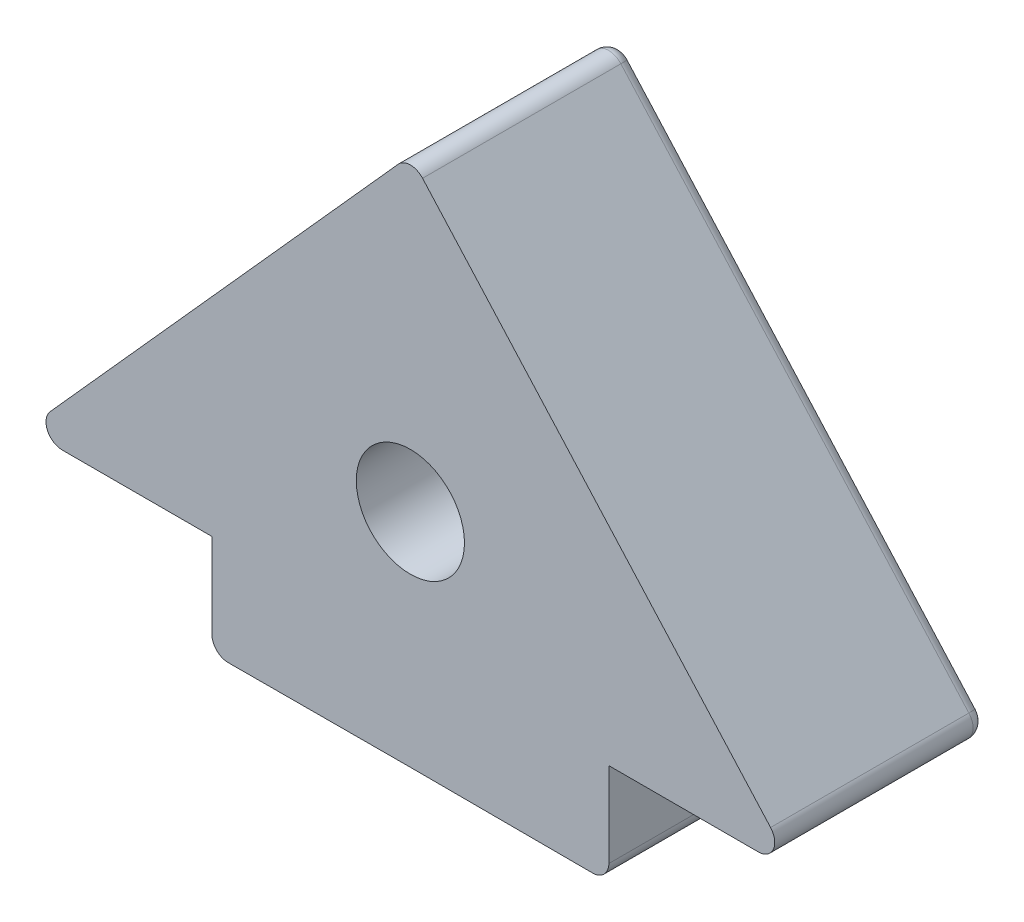
ISO-10303-21;
HEADER;
FILE_DESCRIPTION(('STEP AP214'),'2;1');
FILE_NAME('part.step','',(''),(''),'','','');
FILE_SCHEMA(('AUTOMOTIVE_DESIGN { 1 0 10303 214 1 1 1 1 }'));
ENDSEC;
DATA;
#1=APPLICATION_CONTEXT('core data for automotive mechanical design processes');
#2=APPLICATION_PROTOCOL_DEFINITION('international standard','automotive_design',2000,#1);
#3=PRODUCT_CONTEXT('',#1,'mechanical');
#4=PRODUCT('Part','Part','',(#3));
#5=PRODUCT_RELATED_PRODUCT_CATEGORY('part','',(#4));
#6=PRODUCT_DEFINITION_FORMATION('','',#4);
#7=PRODUCT_DEFINITION_CONTEXT('part definition',#1,'design');
#8=PRODUCT_DEFINITION('design','',#6,#7);
#9=PRODUCT_DEFINITION_SHAPE('','',#8);
#10=(LENGTH_UNIT() NAMED_UNIT(*) SI_UNIT(.MILLI.,.METRE.));
#11=(NAMED_UNIT(*) PLANE_ANGLE_UNIT() SI_UNIT($,.RADIAN.));
#12=(NAMED_UNIT(*) SI_UNIT($,.STERADIAN.) SOLID_ANGLE_UNIT());
#13=UNCERTAINTY_MEASURE_WITH_UNIT(LENGTH_MEASURE(1.E-05),#10,'distance_accuracy_value','');
#14=(GEOMETRIC_REPRESENTATION_CONTEXT(3) GLOBAL_UNCERTAINTY_ASSIGNED_CONTEXT((#13)) GLOBAL_UNIT_ASSIGNED_CONTEXT((#10,
#11,#12)) REPRESENTATION_CONTEXT('',''));
#15=CARTESIAN_POINT('',(0.,0.,0.));
#16=DIRECTION('',(0.,0.,1.));
#17=DIRECTION('',(1.,0.,0.));
#18=AXIS2_PLACEMENT_3D('',#15,#16,#17);
#19=CARTESIAN_POINT('',(0.,-1.30828258674903,7.));
#20=DIRECTION('',(0.,0.,-1.));
#21=DIRECTION('',(-1.,0.,0.));
#22=AXIS2_PLACEMENT_3D('',#19,#20,#21);
#23=CYLINDRICAL_SURFACE('',#22,1.8);
#24=CARTESIAN_POINT('',(0.,-1.30828258674903,7.));
#25=DIRECTION('',(0.,0.,1.));
#26=DIRECTION('',(1.,0.,0.));
#27=AXIS2_PLACEMENT_3D('',#24,#25,#26);
#28=CIRCLE('',#27,1.8);
#29=CARTESIAN_POINT('',(1.80000000000001,-1.30828258674903,7.));
#30=VERTEX_POINT('',#29);
#31=EDGE_CURVE('E195',#30,#30,#28,.T.);
#32=ORIENTED_EDGE('',*,*,#31,.T.);
#33=EDGE_LOOP('',(#32));
#34=FACE_BOUND('',#33,.T.);
#35=CARTESIAN_POINT('',(0.,-1.30828258674903,2.));
#36=DIRECTION('',(0.,0.,-1.));
#37=DIRECTION('',(-1.,0.,0.));
#38=AXIS2_PLACEMENT_3D('',#35,#36,#37);
#39=CIRCLE('',#38,1.8);
#40=CARTESIAN_POINT('',(-1.79999999999999,-1.30828258674903,2.));
#41=VERTEX_POINT('',#40);
#42=EDGE_CURVE('E289',#41,#41,#39,.T.);
#43=ORIENTED_EDGE('',*,*,#42,.T.);
#44=EDGE_LOOP('',(#43));
#45=FACE_BOUND('',#44,.T.);
#46=ADVANCED_FACE('F35',(#34,#45),#23,.F.);
#47=CARTESIAN_POINT('',(0.,8.14273922744921,7.));
#48=DIRECTION('',(0.,0.,1.));
#49=DIRECTION('',(1.,0.,0.));
#50=AXIS2_PLACEMENT_3D('',#47,#48,#49);
#51=PLANE('',#50);
#52=CARTESIAN_POINT('',(0.,8.14273922744921,7.));
#53=DIRECTION('',(0.,0.,1.));
#54=DIRECTION('',(1.,0.,0.));
#55=AXIS2_PLACEMENT_3D('',#52,#53,#54);
#56=CIRCLE('',#55,0.544410820616518);
#57=CARTESIAN_POINT('',(0.405379360705237,8.5061270581736,7.));
#58=VERTEX_POINT('',#57);
#59=CARTESIAN_POINT('',(-0.405379360705209,8.50612705817359,7.));
#60=VERTEX_POINT('',#59);
#61=EDGE_CURVE('E185',#58,#60,#56,.T.);
#62=ORIENTED_EDGE('',*,*,#61,.T.);
#63=DIRECTION('',(-0.667488258798507,-0.744620322289244,0.));
#64=VECTOR('',#63,1.);
#65=CARTESIAN_POINT('',(-0.405379360705209,8.50612705817359,7.));
#66=LINE('',#65,#64);
#67=CARTESIAN_POINT('',(-11.9870607409533,-4.41388345637082,7.));
#68=VERTEX_POINT('',#67);
#69=EDGE_CURVE('E174',#60,#68,#66,.T.);
#70=ORIENTED_EDGE('',*,*,#69,.T.);
#71=CARTESIAN_POINT('',(-11.581681380248,-4.77727128709523,7.));
#72=DIRECTION('',(0.,0.,1.));
#73=DIRECTION('',(1.,0.,0.));
#74=AXIS2_PLACEMENT_3D('',#71,#72,#73);
#75=CIRCLE('',#74,0.544410820616544);
#76=CARTESIAN_POINT('',(-11.581681380248,-5.32168210771177,7.));
#77=VERTEX_POINT('',#76);
#78=EDGE_CURVE('E184',#68,#77,#75,.T.);
#79=ORIENTED_EDGE('',*,*,#78,.T.);
#80=DIRECTION('',(1.,0.,0.));
#81=VECTOR('',#80,1.);
#82=CARTESIAN_POINT('',(-11.581681380248,-5.32168210771176,7.));
#83=LINE('',#82,#81);
#84=CARTESIAN_POINT('',(-6.60521513926172,-5.32168210771173,7.));
#85=VERTEX_POINT('',#84);
#86=EDGE_CURVE('E302',#77,#85,#83,.T.);
#87=ORIENTED_EDGE('',*,*,#86,.T.);
#88=DIRECTION('',(0.,-1.,0.));
#89=VECTOR('',#88,1.);
#90=CARTESIAN_POINT('',(-6.60521513926172,-5.32168210771173,7.));
#91=LINE('',#90,#89);
#92=CARTESIAN_POINT('',(-6.60521513926172,-8.14273922744922,7.));
#93=VERTEX_POINT('',#92);
#94=EDGE_CURVE('E304',#85,#93,#91,.T.);
#95=ORIENTED_EDGE('',*,*,#94,.T.);
#96=CARTESIAN_POINT('',(-6.0608043186452,-8.14273922744922,7.));
#97=DIRECTION('',(0.,0.,1.));
#98=DIRECTION('',(1.,0.,0.));
#99=AXIS2_PLACEMENT_3D('',#96,#97,#98);
#100=CIRCLE('',#99,0.544410820616517);
#101=CARTESIAN_POINT('',(-6.05945404471599,-8.68714837355595,7.));
#102=VERTEX_POINT('',#101);
#103=EDGE_CURVE('E306',#93,#102,#100,.T.);
#104=ORIENTED_EDGE('',*,*,#103,.T.);
#105=DIRECTION('',(0.999996924179834,0.00248024814729872,0.));
#106=VECTOR('',#105,1.);
#107=CARTESIAN_POINT('',(-6.05945404471599,-8.68714837355595,7.));
#108=LINE('',#107,#106);
#109=CARTESIAN_POINT('',(2.79941000935757E-11,-8.67211937766134,7.));
#110=VERTEX_POINT('',#109);
#111=EDGE_CURVE('E308',#102,#110,#108,.T.);
#112=ORIENTED_EDGE('',*,*,#111,.T.);
#113=DIRECTION('',(0.999996924179833,-0.00248024814732191,0.));
#114=VECTOR('',#113,1.);
#115=CARTESIAN_POINT('',(6.05945404471602,-8.68714837355595,7.));
#116=LINE('',#115,#114);
#117=CARTESIAN_POINT('',(6.05945404471602,-8.68714837355595,7.));
#118=VERTEX_POINT('',#117);
#119=EDGE_CURVE('E310',#110,#118,#116,.T.);
#120=ORIENTED_EDGE('',*,*,#119,.T.);
#121=CARTESIAN_POINT('',(6.06080431864523,-8.14273922744922,7.));
#122=DIRECTION('',(0.,0.,1.));
#123=DIRECTION('',(1.,0.,0.));
#124=AXIS2_PLACEMENT_3D('',#121,#122,#123);
#125=CIRCLE('',#124,0.544410820616515);
#126=CARTESIAN_POINT('',(6.60521513926175,-8.14273922744922,7.));
#127=VERTEX_POINT('',#126);
#128=EDGE_CURVE('E312',#118,#127,#125,.T.);
#129=ORIENTED_EDGE('',*,*,#128,.T.);
#130=DIRECTION('',(0.,1.,0.));
#131=VECTOR('',#130,1.);
#132=CARTESIAN_POINT('',(6.60521513926175,-5.32168210771175,7.));
#133=LINE('',#132,#131);
#134=CARTESIAN_POINT('',(6.60521513926175,-5.32168210771175,7.));
#135=VERTEX_POINT('',#134);
#136=EDGE_CURVE('E314',#127,#135,#133,.T.);
#137=ORIENTED_EDGE('',*,*,#136,.T.);
#138=DIRECTION('',(1.,0.,0.));
#139=VECTOR('',#138,1.);
#140=CARTESIAN_POINT('',(11.5816813802481,-5.32168210771175,7.));
#141=LINE('',#140,#139);
#142=CARTESIAN_POINT('',(11.5816813802481,-5.32168210771175,7.));
#143=VERTEX_POINT('',#142);
#144=EDGE_CURVE('E316',#135,#143,#141,.T.);
#145=ORIENTED_EDGE('',*,*,#144,.T.);
#146=CARTESIAN_POINT('',(11.5816813802481,-4.77727128709523,7.));
#147=DIRECTION('',(0.,0.,1.));
#148=DIRECTION('',(1.,0.,0.));
#149=AXIS2_PLACEMENT_3D('',#146,#147,#148);
#150=CIRCLE('',#149,0.544410820616517);
#151=CARTESIAN_POINT('',(11.9870607409533,-4.41388345637085,7.));
#152=VERTEX_POINT('',#151);
#153=EDGE_CURVE('E318',#143,#152,#150,.T.);
#154=ORIENTED_EDGE('',*,*,#153,.T.);
#155=DIRECTION('',(-0.667488258798505,0.744620322289245,0.));
#156=VECTOR('',#155,1.);
#157=CARTESIAN_POINT('',(0.405379360705237,8.5061270581736,7.));
#158=LINE('',#157,#156);
#159=EDGE_CURVE('E191',#152,#58,#158,.T.);
#160=ORIENTED_EDGE('',*,*,#159,.T.);
#161=EDGE_LOOP('',(#62,#70,#79,#87,#95,#104,#112,#120,#129,#137,#145,#154,#160));
#162=FACE_BOUND('',#161,.T.);
#163=ORIENTED_EDGE('',*,*,#31,.F.);
#164=EDGE_LOOP('',(#163));
#165=FACE_BOUND('',#164,.T.);
#166=ADVANCED_FACE('F188',(#162,#165),#51,.T.);
#167=CARTESIAN_POINT('',(0.,8.14273922744921,0.));
#168=DIRECTION('',(0.,0.,1.));
#169=DIRECTION('',(1.,0.,0.));
#170=AXIS2_PLACEMENT_3D('',#167,#168,#169);
#171=PLANE('',#170);
#172=DIRECTION('',(0.999996924179834,-0.00248024814732191,0.));
#173=VECTOR('',#172,1.);
#174=CARTESIAN_POINT('',(-0.0407127943667151,-8.27201716918603,0.));
#175=LINE('',#174,#173);
#176=CARTESIAN_POINT('',(6.06044614397494,-8.28714960388402,0.));
#177=VERTEX_POINT('',#176);
#178=CARTESIAN_POINT('',(-0.000992087024868527,-8.27211568669985,0.));
#179=VERTEX_POINT('',#178);
#180=EDGE_CURVE('E231',#177,#179,#175,.F.);
#181=ORIENTED_EDGE('',*,*,#180,.T.);
#182=DIRECTION('',(0.999996924179834,0.00248024814729872,0.));
#183=VECTOR('',#182,1.);
#184=CARTESIAN_POINT('',(0.0407127943663625,-8.27201716918617,0.));
#185=LINE('',#184,#183);
#186=CARTESIAN_POINT('',(-6.06044614397492,-8.28714960388402,0.));
#187=VERTEX_POINT('',#186);
#188=EDGE_CURVE('E233',#179,#187,#185,.F.);
#189=ORIENTED_EDGE('',*,*,#188,.T.);
#190=CARTESIAN_POINT('',(-6.0608043186452,-8.14273922744922,0.));
#191=DIRECTION('',(0.,0.,1.));
#192=DIRECTION('',(1.,0.,0.));
#193=AXIS2_PLACEMENT_3D('',#190,#191,#192);
#194=CIRCLE('',#193,0.144410820616516);
#195=CARTESIAN_POINT('',(-6.20521513926172,-8.14273922744922,0.));
#196=VERTEX_POINT('',#195);
#197=EDGE_CURVE('E228',#187,#196,#194,.F.);
#198=ORIENTED_EDGE('',*,*,#197,.T.);
#199=DIRECTION('',(0.,-1.,0.));
#200=VECTOR('',#199,1.);
#201=CARTESIAN_POINT('',(-6.20521513926172,8.14273922744921,0.));
#202=LINE('',#201,#200);
#203=CARTESIAN_POINT('',(-6.20521513926172,-4.92168210771173,0.));
#204=VERTEX_POINT('',#203);
#205=EDGE_CURVE('E224',#196,#204,#202,.F.);
#206=ORIENTED_EDGE('',*,*,#205,.T.);
#207=DIRECTION('',(1.,0.,0.));
#208=VECTOR('',#207,1.);
#209=CARTESIAN_POINT('',(0.,-4.9216821077117,0.));
#210=LINE('',#209,#208);
#211=CARTESIAN_POINT('',(-11.581681380248,-4.92168210771177,0.));
#212=VERTEX_POINT('',#211);
#213=EDGE_CURVE('E222',#204,#212,#210,.F.);
#214=ORIENTED_EDGE('',*,*,#213,.T.);
#215=CARTESIAN_POINT('',(-11.581681380248,-4.77727128709523,0.));
#216=DIRECTION('',(0.,0.,1.));
#217=DIRECTION('',(1.,0.,0.));
#218=AXIS2_PLACEMENT_3D('',#215,#216,#217);
#219=CIRCLE('',#218,0.144410820616544);
#220=CARTESIAN_POINT('',(-11.6892126120376,-4.68087875989022,0.));
#221=VERTEX_POINT('',#220);
#222=EDGE_CURVE('E218',#212,#221,#219,.F.);
#223=ORIENTED_EDGE('',*,*,#222,.T.);
#224=DIRECTION('',(-0.667488258798507,-0.744620322289244,0.));
#225=VECTOR('',#224,1.);
#226=CARTESIAN_POINT('',(-0.107531231789511,8.23913175465419,0.));
#227=LINE('',#226,#225);
#228=CARTESIAN_POINT('',(-0.107531231789512,8.23913175465419,0.));
#229=VERTEX_POINT('',#228);
#230=EDGE_CURVE('E214',#221,#229,#227,.F.);
#231=ORIENTED_EDGE('',*,*,#230,.T.);
#232=CARTESIAN_POINT('',(0.,8.14273922744921,0.));
#233=DIRECTION('',(0.,0.,1.));
#234=DIRECTION('',(1.,0.,0.));
#235=AXIS2_PLACEMENT_3D('',#232,#233,#234);
#236=CIRCLE('',#235,0.144410820616518);
#237=CARTESIAN_POINT('',(0.107531231789539,8.23913175465419,0.));
#238=VERTEX_POINT('',#237);
#239=EDGE_CURVE('E210',#229,#238,#236,.F.);
#240=ORIENTED_EDGE('',*,*,#239,.T.);
#241=DIRECTION('',(-0.667488258798505,0.744620322289245,0.));
#242=VECTOR('',#241,1.);
#243=CARTESIAN_POINT('',(0.107531231789539,8.23913175465419,0.));
#244=LINE('',#243,#242);
#245=CARTESIAN_POINT('',(11.6892126120376,-4.68087875989025,0.));
#246=VERTEX_POINT('',#245);
#247=EDGE_CURVE('E203',#238,#246,#244,.F.);
#248=ORIENTED_EDGE('',*,*,#247,.T.);
#249=CARTESIAN_POINT('',(11.5816813802481,-4.77727128709523,0.));
#250=DIRECTION('',(0.,0.,1.));
#251=DIRECTION('',(1.,0.,0.));
#252=AXIS2_PLACEMENT_3D('',#249,#250,#251);
#253=CIRCLE('',#252,0.144410820616517);
#254=CARTESIAN_POINT('',(11.5816813802481,-4.92168210771175,0.));
#255=VERTEX_POINT('',#254);
#256=EDGE_CURVE('E212',#246,#255,#253,.F.);
#257=ORIENTED_EDGE('',*,*,#256,.T.);
#258=DIRECTION('',(1.,0.,0.));
#259=VECTOR('',#258,1.);
#260=CARTESIAN_POINT('',(0.,-4.92168210771175,0.));
#261=LINE('',#260,#259);
#262=CARTESIAN_POINT('',(6.20521513926175,-4.92168210771175,0.));
#263=VERTEX_POINT('',#262);
#264=EDGE_CURVE('E216',#255,#263,#261,.F.);
#265=ORIENTED_EDGE('',*,*,#264,.T.);
#266=DIRECTION('',(0.,1.,0.));
#267=VECTOR('',#266,1.);
#268=CARTESIAN_POINT('',(6.20521513926177,8.1427392274492,0.));
#269=LINE('',#268,#267);
#270=CARTESIAN_POINT('',(6.20521513926175,-8.14273922744922,0.));
#271=VERTEX_POINT('',#270);
#272=EDGE_CURVE('E220',#263,#271,#269,.F.);
#273=ORIENTED_EDGE('',*,*,#272,.T.);
#274=CARTESIAN_POINT('',(6.06080431864523,-8.14273922744922,0.));
#275=DIRECTION('',(0.,0.,1.));
#276=DIRECTION('',(1.,0.,0.));
#277=AXIS2_PLACEMENT_3D('',#274,#275,#276);
#278=CIRCLE('',#277,0.144410820616515);
#279=EDGE_CURVE('E226',#271,#177,#278,.F.);
#280=ORIENTED_EDGE('',*,*,#279,.T.);
#281=EDGE_LOOP('',(#181,#189,#198,#206,#214,#223,#231,#240,#248,#257,#265,#273,#280));
#282=FACE_BOUND('',#281,.T.);
#283=ADVANCED_FACE('F384',(#282),#171,.F.);
#284=CARTESIAN_POINT('',(0.,8.14273922744921,7.));
#285=DIRECTION('',(0.,0.,-1.));
#286=DIRECTION('',(-1.,0.,0.));
#287=AXIS2_PLACEMENT_3D('',#284,#285,#286);
#288=CYLINDRICAL_SURFACE('',#287,0.544410820616518);
#289=DIRECTION('',(0.,0.,-1.));
#290=VECTOR('',#289,1.);
#291=CARTESIAN_POINT('',(0.405379360705237,8.5061270581736,7.));
#292=LINE('',#291,#290);
#293=CARTESIAN_POINT('',(0.405379360705237,8.5061270581736,0.4));
#294=VERTEX_POINT('',#293);
#295=EDGE_CURVE('E321',#58,#294,#292,.T.);
#296=ORIENTED_EDGE('',*,*,#295,.T.);
#297=CARTESIAN_POINT('',(0.,8.14273922744921,0.4));
#298=DIRECTION('',(0.,0.,1.));
#299=DIRECTION('',(1.,0.,0.));
#300=AXIS2_PLACEMENT_3D('',#297,#298,#299);
#301=CIRCLE('',#300,0.544410820616518);
#302=CARTESIAN_POINT('',(-0.405379360705209,8.50612705817359,0.4));
#303=VERTEX_POINT('',#302);
#304=EDGE_CURVE('E199',#294,#303,#301,.T.);
#305=ORIENTED_EDGE('',*,*,#304,.T.);
#306=DIRECTION('',(0.,0.,-1.));
#307=VECTOR('',#306,1.);
#308=CARTESIAN_POINT('',(-0.405379360705209,8.50612705817359,7.));
#309=LINE('',#308,#307);
#310=EDGE_CURVE('E178',#60,#303,#309,.T.);
#311=ORIENTED_EDGE('',*,*,#310,.F.);
#312=ORIENTED_EDGE('',*,*,#61,.F.);
#313=EDGE_LOOP('',(#296,#305,#311,#312));
#314=FACE_BOUND('',#313,.T.);
#315=ADVANCED_FACE('F197',(#314),#288,.T.);
#316=CARTESIAN_POINT('',(-0.405379360705209,8.50612705817359,7.));
#317=DIRECTION('',(0.744620322289244,-0.667488258798507,0.));
#318=DIRECTION('',(0.667488258798507,0.744620322289244,0.));
#319=AXIS2_PLACEMENT_3D('',#316,#317,#318);
#320=PLANE('',#319);
#321=ORIENTED_EDGE('',*,*,#310,.T.);
#322=DIRECTION('',(-0.667488258798507,-0.744620322289244,0.));
#323=VECTOR('',#322,1.);
#324=CARTESIAN_POINT('',(-0.405379360705209,8.50612705817359,0.4));
#325=LINE('',#324,#323);
#326=CARTESIAN_POINT('',(-11.9870607409533,-4.41388345637082,0.4));
#327=VERTEX_POINT('',#326);
#328=EDGE_CURVE('E44',#303,#327,#325,.T.);
#329=ORIENTED_EDGE('',*,*,#328,.T.);
#330=DIRECTION('',(0.,0.,-1.));
#331=VECTOR('',#330,1.);
#332=CARTESIAN_POINT('',(-11.9870607409533,-4.41388345637082,7.));
#333=LINE('',#332,#331);
#334=EDGE_CURVE('E181',#68,#327,#333,.T.);
#335=ORIENTED_EDGE('',*,*,#334,.F.);
#336=ORIENTED_EDGE('',*,*,#69,.F.);
#337=EDGE_LOOP('',(#321,#329,#335,#336));
#338=FACE_BOUND('',#337,.T.);
#339=ADVANCED_FACE('F176',(#338),#320,.F.);
#340=CARTESIAN_POINT('',(-11.581681380248,-4.77727128709523,7.));
#341=DIRECTION('',(0.,0.,-1.));
#342=DIRECTION('',(-1.,0.,0.));
#343=AXIS2_PLACEMENT_3D('',#340,#341,#342);
#344=CYLINDRICAL_SURFACE('',#343,0.544410820616544);
#345=ORIENTED_EDGE('',*,*,#334,.T.);
#346=CARTESIAN_POINT('',(-11.581681380248,-4.77727128709523,0.4));
#347=DIRECTION('',(0.,0.,1.));
#348=DIRECTION('',(1.,0.,0.));
#349=AXIS2_PLACEMENT_3D('',#346,#347,#348);
#350=CIRCLE('',#349,0.544410820616544);
#351=CARTESIAN_POINT('',(-11.581681380248,-5.32168210771177,0.4));
#352=VERTEX_POINT('',#351);
#353=EDGE_CURVE('E239',#327,#352,#350,.T.);
#354=ORIENTED_EDGE('',*,*,#353,.T.);
#355=DIRECTION('',(0.,0.,-1.));
#356=VECTOR('',#355,1.);
#357=CARTESIAN_POINT('',(-11.581681380248,-5.32168210771177,7.));
#358=LINE('',#357,#356);
#359=EDGE_CURVE('E205',#77,#352,#358,.T.);
#360=ORIENTED_EDGE('',*,*,#359,.F.);
#361=ORIENTED_EDGE('',*,*,#78,.F.);
#362=EDGE_LOOP('',(#345,#354,#360,#361));
#363=FACE_BOUND('',#362,.T.);
#364=ADVANCED_FACE('F377',(#363),#344,.T.);
#365=CARTESIAN_POINT('',(-11.581681380248,-5.32168210771176,7.));
#366=DIRECTION('',(0.,1.,0.));
#367=DIRECTION('',(-1.,0.,0.));
#368=AXIS2_PLACEMENT_3D('',#365,#366,#367);
#369=PLANE('',#368);
#370=ORIENTED_EDGE('',*,*,#359,.T.);
#371=DIRECTION('',(1.,0.,0.));
#372=VECTOR('',#371,1.);
#373=CARTESIAN_POINT('',(-11.581681380248,-5.32168210771176,0.4));
#374=LINE('',#373,#372);
#375=CARTESIAN_POINT('',(-6.60521513926172,-5.32168210771173,0.4));
#376=VERTEX_POINT('',#375);
#377=EDGE_CURVE('E246',#352,#376,#374,.T.);
#378=ORIENTED_EDGE('',*,*,#377,.T.);
#379=DIRECTION('',(0.,0.,-1.));
#380=VECTOR('',#379,1.);
#381=CARTESIAN_POINT('',(-6.60521513926172,-5.32168210771173,7.));
#382=LINE('',#381,#380);
#383=EDGE_CURVE('E343',#85,#376,#382,.T.);
#384=ORIENTED_EDGE('',*,*,#383,.F.);
#385=ORIENTED_EDGE('',*,*,#86,.F.);
#386=EDGE_LOOP('',(#370,#378,#384,#385));
#387=FACE_BOUND('',#386,.T.);
#388=ADVANCED_FACE('F350',(#387),#369,.F.);
#389=CARTESIAN_POINT('',(-6.60521513926172,-5.32168210771173,7.));
#390=DIRECTION('',(1.,0.,0.));
#391=DIRECTION('',(0.,0.,-1.));
#392=AXIS2_PLACEMENT_3D('',#389,#390,#391);
#393=PLANE('',#392);
#394=ORIENTED_EDGE('',*,*,#383,.T.);
#395=DIRECTION('',(0.,-1.,0.));
#396=VECTOR('',#395,1.);
#397=CARTESIAN_POINT('',(-6.60521513926172,-5.32168210771173,0.4));
#398=LINE('',#397,#396);
#399=CARTESIAN_POINT('',(-6.60521513926172,-8.14273922744922,0.4));
#400=VERTEX_POINT('',#399);
#401=EDGE_CURVE('E242',#376,#400,#398,.T.);
#402=ORIENTED_EDGE('',*,*,#401,.T.);
#403=DIRECTION('',(0.,0.,-1.));
#404=VECTOR('',#403,1.);
#405=CARTESIAN_POINT('',(-6.60521513926172,-8.14273922744922,7.));
#406=LINE('',#405,#404);
#407=EDGE_CURVE('E340',#93,#400,#406,.T.);
#408=ORIENTED_EDGE('',*,*,#407,.F.);
#409=ORIENTED_EDGE('',*,*,#94,.F.);
#410=EDGE_LOOP('',(#394,#402,#408,#409));
#411=FACE_BOUND('',#410,.T.);
#412=ADVANCED_FACE('F370',(#411),#393,.F.);
#413=CARTESIAN_POINT('',(-6.0608043186452,-8.14273922744922,7.));
#414=DIRECTION('',(0.,0.,-1.));
#415=DIRECTION('',(-1.,0.,0.));
#416=AXIS2_PLACEMENT_3D('',#413,#414,#415);
#417=CYLINDRICAL_SURFACE('',#416,0.544410820616517);
#418=ORIENTED_EDGE('',*,*,#407,.T.);
#419=CARTESIAN_POINT('',(-6.0608043186452,-8.14273922744922,0.4));
#420=DIRECTION('',(0.,0.,1.));
#421=DIRECTION('',(1.,0.,0.));
#422=AXIS2_PLACEMENT_3D('',#419,#420,#421);
#423=CIRCLE('',#422,0.544410820616517);
#424=CARTESIAN_POINT('',(-6.05945404471599,-8.68714837355595,0.4));
#425=VERTEX_POINT('',#424);
#426=EDGE_CURVE('E200',#400,#425,#423,.T.);
#427=ORIENTED_EDGE('',*,*,#426,.T.);
#428=DIRECTION('',(0.,0.,-1.));
#429=VECTOR('',#428,1.);
#430=CARTESIAN_POINT('',(-6.05945404471599,-8.68714837355595,7.));
#431=LINE('',#430,#429);
#432=EDGE_CURVE('E338',#102,#425,#431,.T.);
#433=ORIENTED_EDGE('',*,*,#432,.F.);
#434=ORIENTED_EDGE('',*,*,#103,.F.);
#435=EDGE_LOOP('',(#418,#427,#433,#434));
#436=FACE_BOUND('',#435,.T.);
#437=ADVANCED_FACE('F374',(#436),#417,.T.);
#438=CARTESIAN_POINT('',(-6.05945404471599,-8.68714837355595,7.));
#439=DIRECTION('',(-0.00248024814729872,0.999996924179834,0.));
#440=DIRECTION('',(-0.999996924179834,-0.00248024814729872,0.));
#441=AXIS2_PLACEMENT_3D('',#438,#439,#440);
#442=PLANE('',#441);
#443=ORIENTED_EDGE('',*,*,#432,.T.);
#444=DIRECTION('',(0.999996924179834,0.00248024814729872,0.));
#445=VECTOR('',#444,1.);
#446=CARTESIAN_POINT('',(-6.05945404471599,-8.68714837355595,0.4));
#447=LINE('',#446,#445);
#448=CARTESIAN_POINT('',(2.79941000935757E-11,-8.67211937766134,0.4));
#449=VERTEX_POINT('',#448);
#450=EDGE_CURVE('E52',#425,#449,#447,.T.);
#451=ORIENTED_EDGE('',*,*,#450,.T.);
#452=DIRECTION('',(0.,0.,-1.));
#453=VECTOR('',#452,1.);
#454=CARTESIAN_POINT('',(2.79941000935757E-11,-8.67211937766134,7.));
#455=LINE('',#454,#453);
#456=EDGE_CURVE('E336',#110,#449,#455,.T.);
#457=ORIENTED_EDGE('',*,*,#456,.F.);
#458=ORIENTED_EDGE('',*,*,#111,.F.);
#459=EDGE_LOOP('',(#443,#451,#457,#458));
#460=FACE_BOUND('',#459,.T.);
#461=ADVANCED_FACE('F431',(#460),#442,.F.);
#462=CARTESIAN_POINT('',(6.05945404471602,-8.68714837355595,7.));
#463=DIRECTION('',(0.00248024814732191,0.999996924179834,0.));
#464=DIRECTION('',(-0.999996924179834,0.00248024814732191,0.));
#465=AXIS2_PLACEMENT_3D('',#462,#463,#464);
#466=PLANE('',#465);
#467=ORIENTED_EDGE('',*,*,#456,.T.);
#468=DIRECTION('',(0.999996924179834,-0.00248024814732191,0.));
#469=VECTOR('',#468,1.);
#470=CARTESIAN_POINT('',(6.05945404471602,-8.68714837355595,0.4));
#471=LINE('',#470,#469);
#472=CARTESIAN_POINT('',(6.05945404471602,-8.68714837355595,0.4));
#473=VERTEX_POINT('',#472);
#474=EDGE_CURVE('E249',#449,#473,#471,.T.);
#475=ORIENTED_EDGE('',*,*,#474,.T.);
#476=DIRECTION('',(0.,0.,-1.));
#477=VECTOR('',#476,1.);
#478=CARTESIAN_POINT('',(6.05945404471602,-8.68714837355595,7.));
#479=LINE('',#478,#477);
#480=EDGE_CURVE('E333',#118,#473,#479,.T.);
#481=ORIENTED_EDGE('',*,*,#480,.F.);
#482=ORIENTED_EDGE('',*,*,#119,.F.);
#483=EDGE_LOOP('',(#467,#475,#481,#482));
#484=FACE_BOUND('',#483,.T.);
#485=ADVANCED_FACE('F427',(#484),#466,.F.);
#486=CARTESIAN_POINT('',(6.06080431864523,-8.14273922744922,7.));
#487=DIRECTION('',(0.,0.,-1.));
#488=DIRECTION('',(-1.,0.,0.));
#489=AXIS2_PLACEMENT_3D('',#486,#487,#488);
#490=CYLINDRICAL_SURFACE('',#489,0.544410820616515);
#491=ORIENTED_EDGE('',*,*,#480,.T.);
#492=CARTESIAN_POINT('',(6.06080431864523,-8.14273922744922,0.4));
#493=DIRECTION('',(0.,0.,1.));
#494=DIRECTION('',(1.,0.,0.));
#495=AXIS2_PLACEMENT_3D('',#492,#493,#494);
#496=CIRCLE('',#495,0.544410820616515);
#497=CARTESIAN_POINT('',(6.60521513926175,-8.14273922744922,0.4));
#498=VERTEX_POINT('',#497);
#499=EDGE_CURVE('E235',#473,#498,#496,.T.);
#500=ORIENTED_EDGE('',*,*,#499,.T.);
#501=DIRECTION('',(0.,0.,-1.));
#502=VECTOR('',#501,1.);
#503=CARTESIAN_POINT('',(6.60521513926175,-8.14273922744922,7.));
#504=LINE('',#503,#502);
#505=EDGE_CURVE('E331',#127,#498,#504,.T.);
#506=ORIENTED_EDGE('',*,*,#505,.F.);
#507=ORIENTED_EDGE('',*,*,#128,.F.);
#508=EDGE_LOOP('',(#491,#500,#506,#507));
#509=FACE_BOUND('',#508,.T.);
#510=ADVANCED_FACE('F424',(#509),#490,.T.);
#511=CARTESIAN_POINT('',(6.60521513926175,-5.32168210771175,7.));
#512=DIRECTION('',(-1.,0.,0.));
#513=DIRECTION('',(0.,-1.,0.));
#514=AXIS2_PLACEMENT_3D('',#511,#512,#513);
#515=PLANE('',#514);
#516=ORIENTED_EDGE('',*,*,#505,.T.);
#517=DIRECTION('',(0.,1.,0.));
#518=VECTOR('',#517,1.);
#519=CARTESIAN_POINT('',(6.60521513926175,-5.32168210771175,0.4));
#520=LINE('',#519,#518);
#521=CARTESIAN_POINT('',(6.60521513926175,-5.32168210771175,0.4));
#522=VERTEX_POINT('',#521);
#523=EDGE_CURVE('E60',#498,#522,#520,.T.);
#524=ORIENTED_EDGE('',*,*,#523,.T.);
#525=DIRECTION('',(0.,0.,-1.));
#526=VECTOR('',#525,1.);
#527=CARTESIAN_POINT('',(6.60521513926175,-5.32168210771175,7.));
#528=LINE('',#527,#526);
#529=EDGE_CURVE('E329',#135,#522,#528,.T.);
#530=ORIENTED_EDGE('',*,*,#529,.F.);
#531=ORIENTED_EDGE('',*,*,#136,.F.);
#532=EDGE_LOOP('',(#516,#524,#530,#531));
#533=FACE_BOUND('',#532,.T.);
#534=ADVANCED_FACE('F420',(#533),#515,.F.);
#535=CARTESIAN_POINT('',(11.5816813802481,-5.32168210771175,7.));
#536=DIRECTION('',(0.,1.,0.));
#537=DIRECTION('',(0.,0.,1.));
#538=AXIS2_PLACEMENT_3D('',#535,#536,#537);
#539=PLANE('',#538);
#540=ORIENTED_EDGE('',*,*,#529,.T.);
#541=DIRECTION('',(1.,0.,0.));
#542=VECTOR('',#541,1.);
#543=CARTESIAN_POINT('',(11.5816813802481,-5.32168210771175,0.4));
#544=LINE('',#543,#542);
#545=CARTESIAN_POINT('',(11.5816813802481,-5.32168210771175,0.4));
#546=VERTEX_POINT('',#545);
#547=EDGE_CURVE('E244',#522,#546,#544,.T.);
#548=ORIENTED_EDGE('',*,*,#547,.T.);
#549=DIRECTION('',(0.,0.,-1.));
#550=VECTOR('',#549,1.);
#551=CARTESIAN_POINT('',(11.5816813802481,-5.32168210771175,7.));
#552=LINE('',#551,#550);
#553=EDGE_CURVE('E326',#143,#546,#552,.T.);
#554=ORIENTED_EDGE('',*,*,#553,.F.);
#555=ORIENTED_EDGE('',*,*,#144,.F.);
#556=EDGE_LOOP('',(#540,#548,#554,#555));
#557=FACE_BOUND('',#556,.T.);
#558=ADVANCED_FACE('F416',(#557),#539,.F.);
#559=CARTESIAN_POINT('',(11.5816813802481,-4.77727128709523,7.));
#560=DIRECTION('',(0.,0.,-1.));
#561=DIRECTION('',(-1.,0.,0.));
#562=AXIS2_PLACEMENT_3D('',#559,#560,#561);
#563=CYLINDRICAL_SURFACE('',#562,0.544410820616517);
#564=ORIENTED_EDGE('',*,*,#553,.T.);
#565=CARTESIAN_POINT('',(11.5816813802481,-4.77727128709523,0.4));
#566=DIRECTION('',(0.,0.,1.));
#567=DIRECTION('',(1.,0.,0.));
#568=AXIS2_PLACEMENT_3D('',#565,#566,#567);
#569=CIRCLE('',#568,0.544410820616517);
#570=CARTESIAN_POINT('',(11.9870607409533,-4.41388345637085,0.4));
#571=VERTEX_POINT('',#570);
#572=EDGE_CURVE('E237',#546,#571,#569,.T.);
#573=ORIENTED_EDGE('',*,*,#572,.T.);
#574=DIRECTION('',(0.,0.,-1.));
#575=VECTOR('',#574,1.);
#576=CARTESIAN_POINT('',(11.9870607409533,-4.41388345637085,7.));
#577=LINE('',#576,#575);
#578=EDGE_CURVE('E323',#152,#571,#577,.T.);
#579=ORIENTED_EDGE('',*,*,#578,.F.);
#580=ORIENTED_EDGE('',*,*,#153,.F.);
#581=EDGE_LOOP('',(#564,#573,#579,#580));
#582=FACE_BOUND('',#581,.T.);
#583=ADVANCED_FACE('F412',(#582),#563,.T.);
#584=CARTESIAN_POINT('',(0.405379360705237,8.5061270581736,7.));
#585=DIRECTION('',(-0.744620322289245,-0.667488258798505,0.));
#586=DIRECTION('',(0.667488258798505,-0.744620322289245,0.));
#587=AXIS2_PLACEMENT_3D('',#584,#585,#586);
#588=PLANE('',#587);
#589=ORIENTED_EDGE('',*,*,#578,.T.);
#590=DIRECTION('',(-0.667488258798505,0.744620322289245,0.));
#591=VECTOR('',#590,1.);
#592=CARTESIAN_POINT('',(0.405379360705237,8.5061270581736,0.4));
#593=LINE('',#592,#591);
#594=EDGE_CURVE('E11',#571,#294,#593,.T.);
#595=ORIENTED_EDGE('',*,*,#594,.T.);
#596=ORIENTED_EDGE('',*,*,#295,.F.);
#597=ORIENTED_EDGE('',*,*,#159,.F.);
#598=EDGE_LOOP('',(#589,#595,#596,#597));
#599=FACE_BOUND('',#598,.T.);
#600=ADVANCED_FACE('F409',(#599),#588,.F.);
#601=CARTESIAN_POINT('',(0.,-1.30828258674903,2.));
#602=DIRECTION('',(0.,0.,-1.));
#603=DIRECTION('',(-1.,0.,0.));
#604=AXIS2_PLACEMENT_3D('',#601,#602,#603);
#605=PLANE('',#604);
#606=ORIENTED_EDGE('',*,*,#42,.F.);
#607=EDGE_LOOP('',(#606));
#608=FACE_BOUND('',#607,.T.);
#609=ADVANCED_FACE('F405',(#608),#605,.F.);
#610=CARTESIAN_POINT('',(0.107531231789538,8.23913175465419,0.4));
#611=DIRECTION('',(-0.667488258798505,0.744620322289245,0.));
#612=DIRECTION('',(-0.744620322289245,-0.667488258798505,0.));
#613=AXIS2_PLACEMENT_3D('',#610,#611,#612);
#614=CYLINDRICAL_SURFACE('',#613,0.4);
#615=CARTESIAN_POINT('',(0.107531231789538,8.23913175465419,0.4));
#616=DIRECTION('',(-0.667488258798504,0.744620322289246,0.));
#617=DIRECTION('',(-0.744620322289246,-0.667488258798504,0.));
#618=AXIS2_PLACEMENT_3D('',#615,#616,#617);
#619=CIRCLE('',#618,0.4);
#620=EDGE_CURVE('E283',#294,#238,#619,.T.);
#621=ORIENTED_EDGE('',*,*,#620,.F.);
#622=ORIENTED_EDGE('',*,*,#594,.F.);
#623=CARTESIAN_POINT('',(11.6892126120376,-4.68087875989025,0.4));
#624=DIRECTION('',(0.667488258798503,-0.744620322289247,0.));
#625=DIRECTION('',(0.744620322289247,0.667488258798503,0.));
#626=AXIS2_PLACEMENT_3D('',#623,#624,#625);
#627=CIRCLE('',#626,0.4);
#628=EDGE_CURVE('E39',#246,#571,#627,.T.);
#629=ORIENTED_EDGE('',*,*,#628,.F.);
#630=ORIENTED_EDGE('',*,*,#247,.F.);
#631=EDGE_LOOP('',(#621,#622,#629,#630));
#632=FACE_BOUND('',#631,.T.);
#633=ADVANCED_FACE('F37',(#632),#614,.T.);
#634=CARTESIAN_POINT('',(11.5816813802481,-4.77727128709523,0.4));
#635=DIRECTION('',(0.,0.,1.));
#636=DIRECTION('',(1.,0.,0.));
#637=AXIS2_PLACEMENT_3D('',#634,#635,#636);
#638=DEGENERATE_TOROIDAL_SURFACE('',#637,0.144410820616517,0.4,.T.);
#639=ORIENTED_EDGE('',*,*,#628,.T.);
#640=ORIENTED_EDGE('',*,*,#572,.F.);
#641=CARTESIAN_POINT('',(11.5816813802481,-4.92168210771175,0.4));
#642=DIRECTION('',(-1.,0.,0.));
#643=DIRECTION('',(0.,0.,1.));
#644=AXIS2_PLACEMENT_3D('',#641,#642,#643);
#645=CIRCLE('',#644,0.4);
#646=EDGE_CURVE('E281',#255,#546,#645,.T.);
#647=ORIENTED_EDGE('',*,*,#646,.F.);
#648=ORIENTED_EDGE('',*,*,#256,.F.);
#649=EDGE_LOOP('',(#639,#640,#647,#648));
#650=FACE_BOUND('',#649,.T.);
#651=ADVANCED_FACE('F389',(#650),#638,.T.);
#652=CARTESIAN_POINT('',(0.,8.14273922744921,0.4));
#653=DIRECTION('',(0.,0.,1.));
#654=DIRECTION('',(1.,0.,0.));
#655=AXIS2_PLACEMENT_3D('',#652,#653,#654);
#656=DEGENERATE_TOROIDAL_SURFACE('',#655,0.144410820616518,0.4,.T.);
#657=ORIENTED_EDGE('',*,*,#620,.T.);
#658=ORIENTED_EDGE('',*,*,#239,.F.);
#659=CARTESIAN_POINT('',(-0.107531231789512,8.23913175465419,0.4));
#660=DIRECTION('',(-0.667488258798507,-0.744620322289244,0.));
#661=DIRECTION('',(0.744620322289244,-0.667488258798507,0.));
#662=AXIS2_PLACEMENT_3D('',#659,#660,#661);
#663=CIRCLE('',#662,0.4);
#664=EDGE_CURVE('E278',#303,#229,#663,.T.);
#665=ORIENTED_EDGE('',*,*,#664,.F.);
#666=ORIENTED_EDGE('',*,*,#304,.F.);
#667=EDGE_LOOP('',(#657,#658,#665,#666));
#668=FACE_BOUND('',#667,.T.);
#669=ADVANCED_FACE('F386',(#668),#656,.T.);
#670=CARTESIAN_POINT('',(11.5816813802481,-4.92168210771175,0.4));
#671=DIRECTION('',(1.,0.,0.));
#672=DIRECTION('',(0.,0.,-1.));
#673=AXIS2_PLACEMENT_3D('',#670,#671,#672);
#674=CYLINDRICAL_SURFACE('',#673,0.4);
#675=ORIENTED_EDGE('',*,*,#646,.T.);
#676=ORIENTED_EDGE('',*,*,#547,.F.);
#677=CARTESIAN_POINT('',(6.20521513926175,-4.92168210771175,0.4));
#678=DIRECTION('',(0.707106781186548,0.707106781186547,0.));
#679=DIRECTION('',(0.707106781186547,-0.707106781186548,0.));
#680=AXIS2_PLACEMENT_3D('',#677,#678,#679);
#681=ELLIPSE('',#680,0.565685424949238,0.4);
#682=EDGE_CURVE('E275',#263,#522,#681,.F.);
#683=ORIENTED_EDGE('',*,*,#682,.F.);
#684=ORIENTED_EDGE('',*,*,#264,.F.);
#685=EDGE_LOOP('',(#675,#676,#683,#684));
#686=FACE_BOUND('',#685,.T.);
#687=ADVANCED_FACE('F388',(#686),#674,.T.);
#688=CARTESIAN_POINT('',(-0.107531231789512,8.23913175465419,0.4));
#689=DIRECTION('',(-0.667488258798507,-0.744620322289244,0.));
#690=DIRECTION('',(0.744620322289244,-0.667488258798507,0.));
#691=AXIS2_PLACEMENT_3D('',#688,#689,#690);
#692=CYLINDRICAL_SURFACE('',#691,0.4);
#693=ORIENTED_EDGE('',*,*,#664,.T.);
#694=ORIENTED_EDGE('',*,*,#230,.F.);
#695=CARTESIAN_POINT('',(-11.6892126120376,-4.68087875989022,0.4));
#696=DIRECTION('',(-0.667488258798507,-0.744620322289243,0.));
#697=DIRECTION('',(0.744620322289243,-0.667488258798508,0.));
#698=AXIS2_PLACEMENT_3D('',#695,#696,#697);
#699=CIRCLE('',#698,0.4);
#700=EDGE_CURVE('E272',#327,#221,#699,.T.);
#701=ORIENTED_EDGE('',*,*,#700,.F.);
#702=ORIENTED_EDGE('',*,*,#328,.F.);
#703=EDGE_LOOP('',(#693,#694,#701,#702));
#704=FACE_BOUND('',#703,.T.);
#705=ADVANCED_FACE('F382',(#704),#692,.T.);
#706=CARTESIAN_POINT('',(6.20521513926175,-5.32168210771175,0.4));
#707=DIRECTION('',(0.,1.,0.));
#708=DIRECTION('',(-1.,0.,0.));
#709=AXIS2_PLACEMENT_3D('',#706,#707,#708);
#710=CYLINDRICAL_SURFACE('',#709,0.4);
#711=ORIENTED_EDGE('',*,*,#682,.T.);
#712=ORIENTED_EDGE('',*,*,#523,.F.);
#713=CARTESIAN_POINT('',(6.20521513926175,-8.14273922744922,0.4));
#714=DIRECTION('',(0.,-1.,0.));
#715=DIRECTION('',(0.,0.,-1.));
#716=AXIS2_PLACEMENT_3D('',#713,#714,#715);
#717=CIRCLE('',#716,0.4);
#718=EDGE_CURVE('E269',#271,#498,#717,.T.);
#719=ORIENTED_EDGE('',*,*,#718,.F.);
#720=ORIENTED_EDGE('',*,*,#272,.F.);
#721=EDGE_LOOP('',(#711,#712,#719,#720));
#722=FACE_BOUND('',#721,.T.);
#723=ADVANCED_FACE('F469',(#722),#710,.T.);
#724=CARTESIAN_POINT('',(-11.581681380248,-4.77727128709523,0.4));
#725=DIRECTION('',(0.,0.,1.));
#726=DIRECTION('',(1.,0.,0.));
#727=AXIS2_PLACEMENT_3D('',#724,#725,#726);
#728=DEGENERATE_TOROIDAL_SURFACE('',#727,0.144410820616544,0.4,.T.);
#729=ORIENTED_EDGE('',*,*,#700,.T.);
#730=ORIENTED_EDGE('',*,*,#222,.F.);
#731=CARTESIAN_POINT('',(-11.581681380248,-4.92168210771177,0.4));
#732=DIRECTION('',(1.,0.,0.));
#733=DIRECTION('',(0.,1.,0.));
#734=AXIS2_PLACEMENT_3D('',#731,#732,#733);
#735=CIRCLE('',#734,0.4);
#736=EDGE_CURVE('E266',#352,#212,#735,.T.);
#737=ORIENTED_EDGE('',*,*,#736,.F.);
#738=ORIENTED_EDGE('',*,*,#353,.F.);
#739=EDGE_LOOP('',(#729,#730,#737,#738));
#740=FACE_BOUND('',#739,.T.);
#741=ADVANCED_FACE('F357',(#740),#728,.T.);
#742=CARTESIAN_POINT('',(6.06080431864523,-8.14273922744922,0.4));
#743=DIRECTION('',(0.,0.,1.));
#744=DIRECTION('',(1.,0.,0.));
#745=AXIS2_PLACEMENT_3D('',#742,#743,#744);
#746=DEGENERATE_TOROIDAL_SURFACE('',#745,0.144410820616515,0.4,.T.);
#747=ORIENTED_EDGE('',*,*,#718,.T.);
#748=ORIENTED_EDGE('',*,*,#499,.F.);
#749=CARTESIAN_POINT('',(6.06044614397494,-8.28714960388402,0.4));
#750=DIRECTION('',(-0.999996924179834,0.00248024814731651,0.));
#751=DIRECTION('',(-0.00248024814731651,-0.999996924179834,0.));
#752=AXIS2_PLACEMENT_3D('',#749,#750,#751);
#753=CIRCLE('',#752,0.4);
#754=EDGE_CURVE('E263',#177,#473,#753,.T.);
#755=ORIENTED_EDGE('',*,*,#754,.F.);
#756=ORIENTED_EDGE('',*,*,#279,.F.);
#757=EDGE_LOOP('',(#747,#748,#755,#756));
#758=FACE_BOUND('',#757,.T.);
#759=ADVANCED_FACE('F463',(#758),#746,.T.);
#760=CARTESIAN_POINT('',(-11.581681380248,-4.92168210771176,0.4));
#761=DIRECTION('',(1.,0.,0.));
#762=DIRECTION('',(0.,1.,0.));
#763=AXIS2_PLACEMENT_3D('',#760,#761,#762);
#764=CYLINDRICAL_SURFACE('',#763,0.4);
#765=ORIENTED_EDGE('',*,*,#736,.T.);
#766=ORIENTED_EDGE('',*,*,#213,.F.);
#767=CARTESIAN_POINT('',(-6.20521513926172,-4.92168210771173,0.4));
#768=DIRECTION('',(0.707106781186549,-0.707106781186546,0.));
#769=DIRECTION('',(-0.707106781186546,-0.707106781186549,0.));
#770=AXIS2_PLACEMENT_3D('',#767,#768,#769);
#771=ELLIPSE('',#770,0.56568542494924,0.4);
#772=EDGE_CURVE('E260',#376,#204,#771,.T.);
#773=ORIENTED_EDGE('',*,*,#772,.F.);
#774=ORIENTED_EDGE('',*,*,#377,.F.);
#775=EDGE_LOOP('',(#765,#766,#773,#774));
#776=FACE_BOUND('',#775,.T.);
#777=ADVANCED_FACE('F361',(#776),#764,.T.);
#778=CARTESIAN_POINT('',(6.06044614397495,-8.28714960388402,0.4));
#779=DIRECTION('',(0.999996924179834,-0.00248024814732191,0.));
#780=DIRECTION('',(0.00248024814732191,0.999996924179834,0.));
#781=AXIS2_PLACEMENT_3D('',#778,#779,#780);
#782=CYLINDRICAL_SURFACE('',#781,0.4);
#783=ORIENTED_EDGE('',*,*,#754,.T.);
#784=ORIENTED_EDGE('',*,*,#474,.F.);
#785=CARTESIAN_POINT('',(-0.000992087024868527,-8.27211568669985,0.4));
#786=DIRECTION('',(-0.9999969243312,-0.00248018711814069,0.));
#787=DIRECTION('',(0.00248018711814069,-0.9999969243312,0.));
#788=AXIS2_PLACEMENT_3D('',#785,#786,#787);
#789=CIRCLE('',#788,0.4);
#790=EDGE_CURVE('E257',#179,#449,#789,.T.);
#791=ORIENTED_EDGE('',*,*,#790,.F.);
#792=ORIENTED_EDGE('',*,*,#180,.F.);
#793=EDGE_LOOP('',(#783,#784,#791,#792));
#794=FACE_BOUND('',#793,.T.);
#795=ADVANCED_FACE('F457',(#794),#782,.T.);
#796=CARTESIAN_POINT('',(-6.20521513926172,-5.32168210771173,0.4));
#797=DIRECTION('',(0.,-1.,0.));
#798=DIRECTION('',(0.,0.,-1.));
#799=AXIS2_PLACEMENT_3D('',#796,#797,#798);
#800=CYLINDRICAL_SURFACE('',#799,0.4);
#801=ORIENTED_EDGE('',*,*,#772,.T.);
#802=ORIENTED_EDGE('',*,*,#205,.F.);
#803=CARTESIAN_POINT('',(-6.20521513926172,-8.14273922744922,0.4));
#804=DIRECTION('',(0.,-1.,0.));
#805=DIRECTION('',(0.,0.,-1.));
#806=AXIS2_PLACEMENT_3D('',#803,#804,#805);
#807=CIRCLE('',#806,0.4);
#808=EDGE_CURVE('E255',#400,#196,#807,.T.);
#809=ORIENTED_EDGE('',*,*,#808,.F.);
#810=ORIENTED_EDGE('',*,*,#401,.F.);
#811=EDGE_LOOP('',(#801,#802,#809,#810));
#812=FACE_BOUND('',#811,.T.);
#813=ADVANCED_FACE('F366',(#812),#800,.T.);
#814=CARTESIAN_POINT('',(-6.06044614397491,-8.28714960388401,0.4));
#815=DIRECTION('',(0.999996924179834,0.00248024814729872,0.));
#816=DIRECTION('',(-0.00248024814729872,0.999996924179834,0.));
#817=AXIS2_PLACEMENT_3D('',#814,#815,#816);
#818=CYLINDRICAL_SURFACE('',#817,0.4);
#819=ORIENTED_EDGE('',*,*,#790,.T.);
#820=ORIENTED_EDGE('',*,*,#450,.F.);
#821=CARTESIAN_POINT('',(-6.06044614397492,-8.28714960388401,0.4));
#822=DIRECTION('',(-0.999996924179834,-0.00248024814731868,0.));
#823=DIRECTION('',(0.00248024814731868,-0.999996924179834,0.));
#824=AXIS2_PLACEMENT_3D('',#821,#822,#823);
#825=CIRCLE('',#824,0.4);
#826=EDGE_CURVE('E253',#187,#425,#825,.T.);
#827=ORIENTED_EDGE('',*,*,#826,.F.);
#828=ORIENTED_EDGE('',*,*,#188,.F.);
#829=EDGE_LOOP('',(#819,#820,#827,#828));
#830=FACE_BOUND('',#829,.T.);
#831=ADVANCED_FACE('F450',(#830),#818,.T.);
#832=CARTESIAN_POINT('',(-6.0608043186452,-8.14273922744922,0.4));
#833=DIRECTION('',(0.,0.,1.));
#834=DIRECTION('',(1.,0.,0.));
#835=AXIS2_PLACEMENT_3D('',#832,#833,#834);
#836=DEGENERATE_TOROIDAL_SURFACE('',#835,0.144410820616516,0.4,.T.);
#837=ORIENTED_EDGE('',*,*,#808,.T.);
#838=ORIENTED_EDGE('',*,*,#197,.F.);
#839=ORIENTED_EDGE('',*,*,#826,.T.);
#840=ORIENTED_EDGE('',*,*,#426,.F.);
#841=EDGE_LOOP('',(#837,#838,#839,#840));
#842=FACE_BOUND('',#841,.T.);
#843=ADVANCED_FACE('F447',(#842),#836,.T.);
#844=CLOSED_SHELL('',(#46,#166,#283,#315,#339,#364,#388,#412,#437,#461,#485,#510,#534,#558,#583,
#600,#609,#633,#651,#669,#687,#705,#723,#741,#759,#777,#795,#813,#831,#843));
#845=MANIFOLD_SOLID_BREP('B2',#844);
#846=ADVANCED_BREP_SHAPE_REPRESENTATION('',(#18,#845),#14);
#847=SHAPE_DEFINITION_REPRESENTATION(#9,#846);
ENDSEC;
END-ISO-10303-21;
